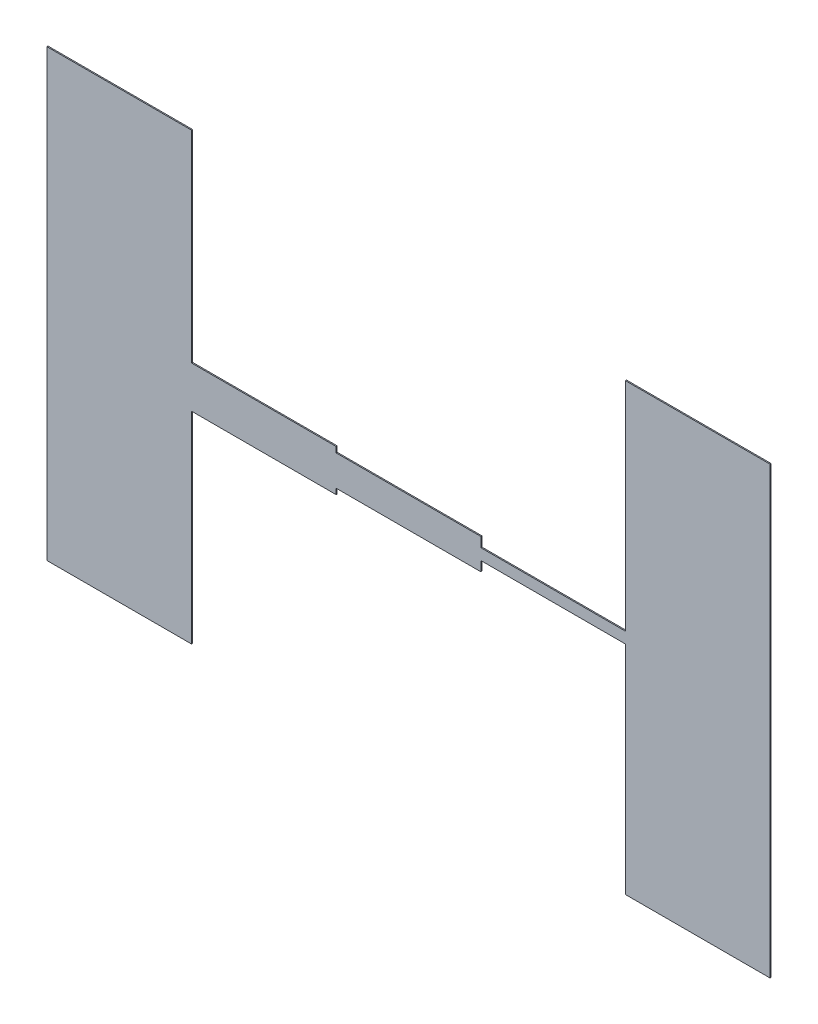
ISO-10303-21;
HEADER;
FILE_DESCRIPTION(('STEP AP214'),'2;1');
FILE_NAME('part.step','',(''),(''),'','','');
FILE_SCHEMA(('AUTOMOTIVE_DESIGN { 1 0 10303 214 1 1 1 1 }'));
ENDSEC;
DATA;
#1=APPLICATION_CONTEXT('core data for automotive mechanical design processes');
#2=APPLICATION_PROTOCOL_DEFINITION('international standard','automotive_design',2000,#1);
#3=PRODUCT_CONTEXT('',#1,'mechanical');
#4=PRODUCT('Part','Part','',(#3));
#5=PRODUCT_RELATED_PRODUCT_CATEGORY('part','',(#4));
#6=PRODUCT_DEFINITION_FORMATION('','',#4);
#7=PRODUCT_DEFINITION_CONTEXT('part definition',#1,'design');
#8=PRODUCT_DEFINITION('design','',#6,#7);
#9=PRODUCT_DEFINITION_SHAPE('','',#8);
#10=(LENGTH_UNIT() NAMED_UNIT(*) SI_UNIT(.MILLI.,.METRE.));
#11=(NAMED_UNIT(*) PLANE_ANGLE_UNIT() SI_UNIT($,.RADIAN.));
#12=(NAMED_UNIT(*) SI_UNIT($,.STERADIAN.) SOLID_ANGLE_UNIT());
#13=UNCERTAINTY_MEASURE_WITH_UNIT(LENGTH_MEASURE(1.E-05),#10,'distance_accuracy_value','');
#14=(GEOMETRIC_REPRESENTATION_CONTEXT(3) GLOBAL_UNCERTAINTY_ASSIGNED_CONTEXT((#13)) GLOBAL_UNIT_ASSIGNED_CONTEXT((#10,
#11,#12)) REPRESENTATION_CONTEXT('',''));
#15=CARTESIAN_POINT('',(0.,0.,0.));
#16=DIRECTION('',(0.,0.,1.));
#17=DIRECTION('',(1.,0.,0.));
#18=AXIS2_PLACEMENT_3D('',#15,#16,#17);
#19=CARTESIAN_POINT('',(4550.,0.,10.));
#20=DIRECTION('',(-1.,0.,0.));
#21=DIRECTION('',(0.,0.,1.));
#22=AXIS2_PLACEMENT_3D('',#19,#20,#21);
#23=PLANE('',#22);
#24=DIRECTION('',(0.,1.,0.));
#25=VECTOR('',#24,1.);
#26=CARTESIAN_POINT('',(4550.,0.,0.));
#27=LINE('',#26,#25);
#28=CARTESIAN_POINT('',(4550.,-2000.,0.));
#29=VERTEX_POINT('',#28);
#30=CARTESIAN_POINT('',(4550.,-49.9999999999999,0.));
#31=VERTEX_POINT('',#30);
#32=EDGE_CURVE('E220',#29,#31,#27,.T.);
#33=ORIENTED_EDGE('',*,*,#32,.F.);
#34=DIRECTION('',(0.,0.,-1.));
#35=VECTOR('',#34,1.);
#36=CARTESIAN_POINT('',(4550.,-2000.,10.));
#37=LINE('',#36,#35);
#38=CARTESIAN_POINT('',(4550.,-2000.,10.));
#39=VERTEX_POINT('',#38);
#40=EDGE_CURVE('E11',#39,#29,#37,.T.);
#41=ORIENTED_EDGE('',*,*,#40,.F.);
#42=DIRECTION('',(0.,1.,0.));
#43=VECTOR('',#42,1.);
#44=CARTESIAN_POINT('',(4550.,0.,10.));
#45=LINE('',#44,#43);
#46=CARTESIAN_POINT('',(4550.,-49.9999999999999,10.));
#47=VERTEX_POINT('',#46);
#48=EDGE_CURVE('E289',#39,#47,#45,.T.);
#49=ORIENTED_EDGE('',*,*,#48,.T.);
#50=DIRECTION('',(0.,0.,-1.));
#51=VECTOR('',#50,1.);
#52=CARTESIAN_POINT('',(4550.,-49.9999999999999,10.));
#53=LINE('',#52,#51);
#54=EDGE_CURVE('E64',#47,#31,#53,.T.);
#55=ORIENTED_EDGE('',*,*,#54,.T.);
#56=EDGE_LOOP('',(#33,#41,#49,#55));
#57=FACE_BOUND('',#56,.T.);
#58=ADVANCED_FACE('F47',(#57),#23,.T.);
#59=CARTESIAN_POINT('',(3.41607084500048E-13,-2000.,10.));
#60=DIRECTION('',(0.,-1.,0.));
#61=DIRECTION('',(1.,0.,0.));
#62=AXIS2_PLACEMENT_3D('',#59,#60,#61);
#63=PLANE('',#62);
#64=DIRECTION('',(-1.,0.,0.));
#65=VECTOR('',#64,1.);
#66=CARTESIAN_POINT('',(3.41607084500048E-13,-2000.,0.));
#67=LINE('',#66,#65);
#68=CARTESIAN_POINT('',(5850.,-2000.,0.));
#69=VERTEX_POINT('',#68);
#70=EDGE_CURVE('E223',#69,#29,#67,.T.);
#71=ORIENTED_EDGE('',*,*,#70,.F.);
#72=DIRECTION('',(0.,0.,-1.));
#73=VECTOR('',#72,1.);
#74=CARTESIAN_POINT('',(5850.,-2000.,10.));
#75=LINE('',#74,#73);
#76=CARTESIAN_POINT('',(5850.,-2000.,10.));
#77=VERTEX_POINT('',#76);
#78=EDGE_CURVE('E56',#77,#69,#75,.T.);
#79=ORIENTED_EDGE('',*,*,#78,.F.);
#80=DIRECTION('',(-1.,0.,0.));
#81=VECTOR('',#80,1.);
#82=CARTESIAN_POINT('',(3.41607084500048E-13,-2000.,10.));
#83=LINE('',#82,#81);
#84=EDGE_CURVE('E359',#77,#39,#83,.T.);
#85=ORIENTED_EDGE('',*,*,#84,.T.);
#86=ORIENTED_EDGE('',*,*,#40,.T.);
#87=EDGE_LOOP('',(#71,#79,#85,#86));
#88=FACE_BOUND('',#87,.T.);
#89=ADVANCED_FACE('F358',(#88),#63,.T.);
#90=CARTESIAN_POINT('',(5850.,0.,10.));
#91=DIRECTION('',(-1.,0.,0.));
#92=DIRECTION('',(0.,0.,1.));
#93=AXIS2_PLACEMENT_3D('',#90,#91,#92);
#94=PLANE('',#93);
#95=DIRECTION('',(0.,1.,0.));
#96=VECTOR('',#95,1.);
#97=CARTESIAN_POINT('',(5850.,0.,0.));
#98=LINE('',#97,#96);
#99=CARTESIAN_POINT('',(5850.,2000.,0.));
#100=VERTEX_POINT('',#99);
#101=EDGE_CURVE('E227',#69,#100,#98,.T.);
#102=ORIENTED_EDGE('',*,*,#101,.T.);
#103=DIRECTION('',(0.,0.,-1.));
#104=VECTOR('',#103,1.);
#105=CARTESIAN_POINT('',(5850.,2000.,10.));
#106=LINE('',#105,#104);
#107=CARTESIAN_POINT('',(5850.,2000.,10.));
#108=VERTEX_POINT('',#107);
#109=EDGE_CURVE('E341',#108,#100,#106,.T.);
#110=ORIENTED_EDGE('',*,*,#109,.F.);
#111=DIRECTION('',(0.,1.,0.));
#112=VECTOR('',#111,1.);
#113=CARTESIAN_POINT('',(5850.,0.,10.));
#114=LINE('',#113,#112);
#115=EDGE_CURVE('E350',#77,#108,#114,.T.);
#116=ORIENTED_EDGE('',*,*,#115,.F.);
#117=ORIENTED_EDGE('',*,*,#78,.T.);
#118=EDGE_LOOP('',(#102,#110,#116,#117));
#119=FACE_BOUND('',#118,.T.);
#120=ADVANCED_FACE('F348',(#119),#94,.F.);
#121=CARTESIAN_POINT('',(0.,2000.,10.));
#122=DIRECTION('',(0.,-1.,0.));
#123=DIRECTION('',(0.,0.,-1.));
#124=AXIS2_PLACEMENT_3D('',#121,#122,#123);
#125=PLANE('',#124);
#126=DIRECTION('',(-1.,0.,0.));
#127=VECTOR('',#126,1.);
#128=CARTESIAN_POINT('',(0.,2000.,0.));
#129=LINE('',#128,#127);
#130=CARTESIAN_POINT('',(4550.,2000.,0.));
#131=VERTEX_POINT('',#130);
#132=EDGE_CURVE('E230',#100,#131,#129,.T.);
#133=ORIENTED_EDGE('',*,*,#132,.T.);
#134=DIRECTION('',(0.,0.,-1.));
#135=VECTOR('',#134,1.);
#136=CARTESIAN_POINT('',(4550.,2000.,10.));
#137=LINE('',#136,#135);
#138=CARTESIAN_POINT('',(4550.,2000.,10.));
#139=VERTEX_POINT('',#138);
#140=EDGE_CURVE('E338',#139,#131,#137,.T.);
#141=ORIENTED_EDGE('',*,*,#140,.F.);
#142=DIRECTION('',(-1.,0.,0.));
#143=VECTOR('',#142,1.);
#144=CARTESIAN_POINT('',(0.,2000.,10.));
#145=LINE('',#144,#143);
#146=EDGE_CURVE('E609',#108,#139,#145,.T.);
#147=ORIENTED_EDGE('',*,*,#146,.F.);
#148=ORIENTED_EDGE('',*,*,#109,.T.);
#149=EDGE_LOOP('',(#133,#141,#147,#148));
#150=FACE_BOUND('',#149,.T.);
#151=ADVANCED_FACE('F377',(#150),#125,.F.);
#152=CARTESIAN_POINT('',(4550.,0.,10.));
#153=DIRECTION('',(-1.,0.,0.));
#154=DIRECTION('',(0.,0.,1.));
#155=AXIS2_PLACEMENT_3D('',#152,#153,#154);
#156=PLANE('',#155);
#157=DIRECTION('',(0.,1.,0.));
#158=VECTOR('',#157,1.);
#159=CARTESIAN_POINT('',(4550.,0.,0.));
#160=LINE('',#159,#158);
#161=CARTESIAN_POINT('',(4550.,50.0000000000001,0.));
#162=VERTEX_POINT('',#161);
#163=EDGE_CURVE('E234',#162,#131,#160,.T.);
#164=ORIENTED_EDGE('',*,*,#163,.F.);
#165=DIRECTION('',(0.,0.,-1.));
#166=VECTOR('',#165,1.);
#167=CARTESIAN_POINT('',(4550.,50.0000000000001,10.));
#168=LINE('',#167,#166);
#169=CARTESIAN_POINT('',(4550.,50.0000000000001,10.));
#170=VERTEX_POINT('',#169);
#171=EDGE_CURVE('E335',#170,#162,#168,.T.);
#172=ORIENTED_EDGE('',*,*,#171,.F.);
#173=DIRECTION('',(0.,1.,0.));
#174=VECTOR('',#173,1.);
#175=CARTESIAN_POINT('',(4550.,0.,10.));
#176=LINE('',#175,#174);
#177=EDGE_CURVE('E607',#170,#139,#176,.T.);
#178=ORIENTED_EDGE('',*,*,#177,.T.);
#179=ORIENTED_EDGE('',*,*,#140,.T.);
#180=EDGE_LOOP('',(#164,#172,#178,#179));
#181=FACE_BOUND('',#180,.T.);
#182=ADVANCED_FACE('F382',(#181),#156,.T.);
#183=CARTESIAN_POINT('',(0.,49.9999999999995,10.));
#184=DIRECTION('',(0.,-1.,0.));
#185=DIRECTION('',(1.,0.,0.));
#186=AXIS2_PLACEMENT_3D('',#183,#184,#185);
#187=PLANE('',#186);
#188=DIRECTION('',(-1.,0.,0.));
#189=VECTOR('',#188,1.);
#190=CARTESIAN_POINT('',(0.,49.9999999999995,0.));
#191=LINE('',#190,#189);
#192=CARTESIAN_POINT('',(3250.,49.9999999999999,0.));
#193=VERTEX_POINT('',#192);
#194=EDGE_CURVE('E238',#162,#193,#191,.T.);
#195=ORIENTED_EDGE('',*,*,#194,.T.);
#196=DIRECTION('',(0.,0.,-1.));
#197=VECTOR('',#196,1.);
#198=CARTESIAN_POINT('',(3250.,49.9999999999999,10.));
#199=LINE('',#198,#197);
#200=CARTESIAN_POINT('',(3250.,49.9999999999999,10.));
#201=VERTEX_POINT('',#200);
#202=EDGE_CURVE('E331',#201,#193,#199,.T.);
#203=ORIENTED_EDGE('',*,*,#202,.F.);
#204=DIRECTION('',(-1.,0.,0.));
#205=VECTOR('',#204,1.);
#206=CARTESIAN_POINT('',(0.,49.9999999999995,10.));
#207=LINE('',#206,#205);
#208=EDGE_CURVE('E602',#170,#201,#207,.T.);
#209=ORIENTED_EDGE('',*,*,#208,.F.);
#210=ORIENTED_EDGE('',*,*,#171,.T.);
#211=EDGE_LOOP('',(#195,#203,#209,#210));
#212=FACE_BOUND('',#211,.T.);
#213=ADVANCED_FACE('F386',(#212),#187,.F.);
#214=CARTESIAN_POINT('',(3250.,0.,10.));
#215=DIRECTION('',(-1.,0.,0.));
#216=DIRECTION('',(0.,0.,1.));
#217=AXIS2_PLACEMENT_3D('',#214,#215,#216);
#218=PLANE('',#217);
#219=DIRECTION('',(0.,1.,0.));
#220=VECTOR('',#219,1.);
#221=CARTESIAN_POINT('',(3250.,0.,0.));
#222=LINE('',#221,#220);
#223=CARTESIAN_POINT('',(3250.,137.5,0.));
#224=VERTEX_POINT('',#223);
#225=EDGE_CURVE('E241',#193,#224,#222,.T.);
#226=ORIENTED_EDGE('',*,*,#225,.T.);
#227=DIRECTION('',(0.,0.,-1.));
#228=VECTOR('',#227,1.);
#229=CARTESIAN_POINT('',(3250.,137.5,10.));
#230=LINE('',#229,#228);
#231=CARTESIAN_POINT('',(3250.,137.5,10.));
#232=VERTEX_POINT('',#231);
#233=EDGE_CURVE('E327',#232,#224,#230,.T.);
#234=ORIENTED_EDGE('',*,*,#233,.F.);
#235=DIRECTION('',(0.,1.,0.));
#236=VECTOR('',#235,1.);
#237=CARTESIAN_POINT('',(3250.,0.,10.));
#238=LINE('',#237,#236);
#239=EDGE_CURVE('E599',#201,#232,#238,.T.);
#240=ORIENTED_EDGE('',*,*,#239,.F.);
#241=ORIENTED_EDGE('',*,*,#202,.T.);
#242=EDGE_LOOP('',(#226,#234,#240,#241));
#243=FACE_BOUND('',#242,.T.);
#244=ADVANCED_FACE('F390',(#243),#218,.F.);
#245=CARTESIAN_POINT('',(0.,137.5,10.));
#246=DIRECTION('',(0.,-1.,0.));
#247=DIRECTION('',(1.,0.,0.));
#248=AXIS2_PLACEMENT_3D('',#245,#246,#247);
#249=PLANE('',#248);
#250=DIRECTION('',(-1.,0.,0.));
#251=VECTOR('',#250,1.);
#252=CARTESIAN_POINT('',(0.,137.5,0.));
#253=LINE('',#252,#251);
#254=CARTESIAN_POINT('',(1950.,137.5,0.));
#255=VERTEX_POINT('',#254);
#256=EDGE_CURVE('E244',#224,#255,#253,.T.);
#257=ORIENTED_EDGE('',*,*,#256,.T.);
#258=DIRECTION('',(0.,0.,-1.));
#259=VECTOR('',#258,1.);
#260=CARTESIAN_POINT('',(1950.,137.5,10.));
#261=LINE('',#260,#259);
#262=CARTESIAN_POINT('',(1950.,137.5,10.));
#263=VERTEX_POINT('',#262);
#264=EDGE_CURVE('E323',#263,#255,#261,.T.);
#265=ORIENTED_EDGE('',*,*,#264,.F.);
#266=DIRECTION('',(-1.,0.,0.));
#267=VECTOR('',#266,1.);
#268=CARTESIAN_POINT('',(0.,137.5,10.));
#269=LINE('',#268,#267);
#270=EDGE_CURVE('E597',#232,#263,#269,.T.);
#271=ORIENTED_EDGE('',*,*,#270,.F.);
#272=ORIENTED_EDGE('',*,*,#233,.T.);
#273=EDGE_LOOP('',(#257,#265,#271,#272));
#274=FACE_BOUND('',#273,.T.);
#275=ADVANCED_FACE('F394',(#274),#249,.F.);
#276=CARTESIAN_POINT('',(1950.,0.,10.));
#277=DIRECTION('',(-1.,0.,0.));
#278=DIRECTION('',(0.,0.,1.));
#279=AXIS2_PLACEMENT_3D('',#276,#277,#278);
#280=PLANE('',#279);
#281=DIRECTION('',(0.,1.,0.));
#282=VECTOR('',#281,1.);
#283=CARTESIAN_POINT('',(1950.,0.,0.));
#284=LINE('',#283,#282);
#285=CARTESIAN_POINT('',(1950.,187.5,0.));
#286=VERTEX_POINT('',#285);
#287=EDGE_CURVE('E247',#255,#286,#284,.T.);
#288=ORIENTED_EDGE('',*,*,#287,.T.);
#289=DIRECTION('',(0.,0.,-1.));
#290=VECTOR('',#289,1.);
#291=CARTESIAN_POINT('',(1950.,187.5,10.));
#292=LINE('',#291,#290);
#293=CARTESIAN_POINT('',(1950.,187.5,10.));
#294=VERTEX_POINT('',#293);
#295=EDGE_CURVE('E319',#294,#286,#292,.T.);
#296=ORIENTED_EDGE('',*,*,#295,.F.);
#297=DIRECTION('',(0.,1.,0.));
#298=VECTOR('',#297,1.);
#299=CARTESIAN_POINT('',(1950.,0.,10.));
#300=LINE('',#299,#298);
#301=EDGE_CURVE('E590',#263,#294,#300,.T.);
#302=ORIENTED_EDGE('',*,*,#301,.F.);
#303=ORIENTED_EDGE('',*,*,#264,.T.);
#304=EDGE_LOOP('',(#288,#296,#302,#303));
#305=FACE_BOUND('',#304,.T.);
#306=ADVANCED_FACE('F398',(#305),#280,.F.);
#307=CARTESIAN_POINT('',(0.,187.499999999999,10.));
#308=DIRECTION('',(0.,-1.,0.));
#309=DIRECTION('',(1.,0.,0.));
#310=AXIS2_PLACEMENT_3D('',#307,#308,#309);
#311=PLANE('',#310);
#312=DIRECTION('',(-1.,0.,0.));
#313=VECTOR('',#312,1.);
#314=CARTESIAN_POINT('',(0.,187.499999999999,0.));
#315=LINE('',#314,#313);
#316=CARTESIAN_POINT('',(650.,187.5,0.));
#317=VERTEX_POINT('',#316);
#318=EDGE_CURVE('E250',#286,#317,#315,.T.);
#319=ORIENTED_EDGE('',*,*,#318,.T.);
#320=DIRECTION('',(0.,0.,-1.));
#321=VECTOR('',#320,1.);
#322=CARTESIAN_POINT('',(650.,187.5,10.));
#323=LINE('',#322,#321);
#324=CARTESIAN_POINT('',(650.,187.5,10.));
#325=VERTEX_POINT('',#324);
#326=EDGE_CURVE('E315',#325,#317,#323,.T.);
#327=ORIENTED_EDGE('',*,*,#326,.F.);
#328=DIRECTION('',(-1.,0.,0.));
#329=VECTOR('',#328,1.);
#330=CARTESIAN_POINT('',(0.,187.499999999999,10.));
#331=LINE('',#330,#329);
#332=EDGE_CURVE('E587',#294,#325,#331,.T.);
#333=ORIENTED_EDGE('',*,*,#332,.F.);
#334=ORIENTED_EDGE('',*,*,#295,.T.);
#335=EDGE_LOOP('',(#319,#327,#333,#334));
#336=FACE_BOUND('',#335,.T.);
#337=ADVANCED_FACE('F402',(#336),#311,.F.);
#338=CARTESIAN_POINT('',(650.,0.,10.));
#339=DIRECTION('',(-1.,0.,0.));
#340=DIRECTION('',(0.,0.,1.));
#341=AXIS2_PLACEMENT_3D('',#338,#339,#340);
#342=PLANE('',#341);
#343=DIRECTION('',(0.,1.,0.));
#344=VECTOR('',#343,1.);
#345=CARTESIAN_POINT('',(650.,0.,0.));
#346=LINE('',#345,#344);
#347=CARTESIAN_POINT('',(650.,2000.,0.));
#348=VERTEX_POINT('',#347);
#349=EDGE_CURVE('E253',#317,#348,#346,.T.);
#350=ORIENTED_EDGE('',*,*,#349,.T.);
#351=DIRECTION('',(0.,0.,-1.));
#352=VECTOR('',#351,1.);
#353=CARTESIAN_POINT('',(650.,2000.,10.));
#354=LINE('',#353,#352);
#355=CARTESIAN_POINT('',(650.,2000.,10.));
#356=VERTEX_POINT('',#355);
#357=EDGE_CURVE('E312',#356,#348,#354,.T.);
#358=ORIENTED_EDGE('',*,*,#357,.F.);
#359=DIRECTION('',(0.,1.,0.));
#360=VECTOR('',#359,1.);
#361=CARTESIAN_POINT('',(650.,0.,10.));
#362=LINE('',#361,#360);
#363=EDGE_CURVE('E585',#325,#356,#362,.T.);
#364=ORIENTED_EDGE('',*,*,#363,.F.);
#365=ORIENTED_EDGE('',*,*,#326,.T.);
#366=EDGE_LOOP('',(#350,#358,#364,#365));
#367=FACE_BOUND('',#366,.T.);
#368=ADVANCED_FACE('F406',(#367),#342,.F.);
#369=CARTESIAN_POINT('',(0.,2000.,10.));
#370=DIRECTION('',(0.,1.,0.));
#371=DIRECTION('',(0.,0.,1.));
#372=AXIS2_PLACEMENT_3D('',#369,#370,#371);
#373=PLANE('',#372);
#374=DIRECTION('',(1.,0.,0.));
#375=VECTOR('',#374,1.);
#376=CARTESIAN_POINT('',(0.,2000.,0.));
#377=LINE('',#376,#375);
#378=CARTESIAN_POINT('',(-650.,2000.,0.));
#379=VERTEX_POINT('',#378);
#380=EDGE_CURVE('E257',#379,#348,#377,.T.);
#381=ORIENTED_EDGE('',*,*,#380,.F.);
#382=DIRECTION('',(0.,0.,-1.));
#383=VECTOR('',#382,1.);
#384=CARTESIAN_POINT('',(-650.,2000.,10.));
#385=LINE('',#384,#383);
#386=CARTESIAN_POINT('',(-650.,2000.,10.));
#387=VERTEX_POINT('',#386);
#388=EDGE_CURVE('E309',#387,#379,#385,.T.);
#389=ORIENTED_EDGE('',*,*,#388,.F.);
#390=DIRECTION('',(1.,0.,0.));
#391=VECTOR('',#390,1.);
#392=CARTESIAN_POINT('',(0.,2000.,10.));
#393=LINE('',#392,#391);
#394=EDGE_CURVE('E630',#387,#356,#393,.T.);
#395=ORIENTED_EDGE('',*,*,#394,.T.);
#396=ORIENTED_EDGE('',*,*,#357,.T.);
#397=EDGE_LOOP('',(#381,#389,#395,#396));
#398=FACE_BOUND('',#397,.T.);
#399=ADVANCED_FACE('F410',(#398),#373,.T.);
#400=CARTESIAN_POINT('',(-650.,0.,10.));
#401=DIRECTION('',(-1.,0.,0.));
#402=DIRECTION('',(0.,0.,1.));
#403=AXIS2_PLACEMENT_3D('',#400,#401,#402);
#404=PLANE('',#403);
#405=DIRECTION('',(0.,1.,0.));
#406=VECTOR('',#405,1.);
#407=CARTESIAN_POINT('',(-650.,0.,0.));
#408=LINE('',#407,#406);
#409=CARTESIAN_POINT('',(-650.,-2000.,0.));
#410=VERTEX_POINT('',#409);
#411=EDGE_CURVE('E261',#410,#379,#408,.T.);
#412=ORIENTED_EDGE('',*,*,#411,.F.);
#413=DIRECTION('',(0.,0.,-1.));
#414=VECTOR('',#413,1.);
#415=CARTESIAN_POINT('',(-650.,-2000.,10.));
#416=LINE('',#415,#414);
#417=CARTESIAN_POINT('',(-650.,-2000.,10.));
#418=VERTEX_POINT('',#417);
#419=EDGE_CURVE('E306',#418,#410,#416,.T.);
#420=ORIENTED_EDGE('',*,*,#419,.F.);
#421=DIRECTION('',(0.,1.,0.));
#422=VECTOR('',#421,1.);
#423=CARTESIAN_POINT('',(-650.,0.,10.));
#424=LINE('',#423,#422);
#425=EDGE_CURVE('E576',#418,#387,#424,.T.);
#426=ORIENTED_EDGE('',*,*,#425,.T.);
#427=ORIENTED_EDGE('',*,*,#388,.T.);
#428=EDGE_LOOP('',(#412,#420,#426,#427));
#429=FACE_BOUND('',#428,.T.);
#430=ADVANCED_FACE('F414',(#429),#404,.T.);
#431=CARTESIAN_POINT('',(0.,-2000.,10.));
#432=DIRECTION('',(0.,1.,0.));
#433=DIRECTION('',(0.,0.,1.));
#434=AXIS2_PLACEMENT_3D('',#431,#432,#433);
#435=PLANE('',#434);
#436=DIRECTION('',(1.,0.,0.));
#437=VECTOR('',#436,1.);
#438=CARTESIAN_POINT('',(0.,-2000.,0.));
#439=LINE('',#438,#437);
#440=CARTESIAN_POINT('',(650.,-2000.,0.));
#441=VERTEX_POINT('',#440);
#442=EDGE_CURVE('E265',#410,#441,#439,.T.);
#443=ORIENTED_EDGE('',*,*,#442,.T.);
#444=DIRECTION('',(0.,0.,-1.));
#445=VECTOR('',#444,1.);
#446=CARTESIAN_POINT('',(650.,-2000.,10.));
#447=LINE('',#446,#445);
#448=CARTESIAN_POINT('',(650.,-2000.,10.));
#449=VERTEX_POINT('',#448);
#450=EDGE_CURVE('E302',#449,#441,#447,.T.);
#451=ORIENTED_EDGE('',*,*,#450,.F.);
#452=DIRECTION('',(1.,0.,0.));
#453=VECTOR('',#452,1.);
#454=CARTESIAN_POINT('',(0.,-2000.,10.));
#455=LINE('',#454,#453);
#456=EDGE_CURVE('E635',#418,#449,#455,.T.);
#457=ORIENTED_EDGE('',*,*,#456,.F.);
#458=ORIENTED_EDGE('',*,*,#419,.T.);
#459=EDGE_LOOP('',(#443,#451,#457,#458));
#460=FACE_BOUND('',#459,.T.);
#461=ADVANCED_FACE('F418',(#460),#435,.F.);
#462=CARTESIAN_POINT('',(650.,0.,10.));
#463=DIRECTION('',(-1.,0.,0.));
#464=DIRECTION('',(0.,-1.,0.));
#465=AXIS2_PLACEMENT_3D('',#462,#463,#464);
#466=PLANE('',#465);
#467=DIRECTION('',(0.,1.,0.));
#468=VECTOR('',#467,1.);
#469=CARTESIAN_POINT('',(650.,0.,0.));
#470=LINE('',#469,#468);
#471=CARTESIAN_POINT('',(650.,-187.5,0.));
#472=VERTEX_POINT('',#471);
#473=EDGE_CURVE('E268',#441,#472,#470,.T.);
#474=ORIENTED_EDGE('',*,*,#473,.T.);
#475=DIRECTION('',(0.,0.,-1.));
#476=VECTOR('',#475,1.);
#477=CARTESIAN_POINT('',(650.,-187.5,10.));
#478=LINE('',#477,#476);
#479=CARTESIAN_POINT('',(650.,-187.5,10.));
#480=VERTEX_POINT('',#479);
#481=EDGE_CURVE('E299',#480,#472,#478,.T.);
#482=ORIENTED_EDGE('',*,*,#481,.F.);
#483=DIRECTION('',(0.,1.,0.));
#484=VECTOR('',#483,1.);
#485=CARTESIAN_POINT('',(650.,0.,10.));
#486=LINE('',#485,#484);
#487=EDGE_CURVE('E638',#449,#480,#486,.T.);
#488=ORIENTED_EDGE('',*,*,#487,.F.);
#489=ORIENTED_EDGE('',*,*,#450,.T.);
#490=EDGE_LOOP('',(#474,#482,#488,#489));
#491=FACE_BOUND('',#490,.T.);
#492=ADVANCED_FACE('F422',(#491),#466,.F.);
#493=CARTESIAN_POINT('',(0.,-187.500000000001,10.));
#494=DIRECTION('',(0.,-1.,0.));
#495=DIRECTION('',(1.,0.,0.));
#496=AXIS2_PLACEMENT_3D('',#493,#494,#495);
#497=PLANE('',#496);
#498=DIRECTION('',(-1.,0.,0.));
#499=VECTOR('',#498,1.);
#500=CARTESIAN_POINT('',(0.,-187.500000000001,0.));
#501=LINE('',#500,#499);
#502=CARTESIAN_POINT('',(1950.,-187.5,0.));
#503=VERTEX_POINT('',#502);
#504=EDGE_CURVE('E272',#503,#472,#501,.T.);
#505=ORIENTED_EDGE('',*,*,#504,.F.);
#506=DIRECTION('',(0.,0.,-1.));
#507=VECTOR('',#506,1.);
#508=CARTESIAN_POINT('',(1950.,-187.5,10.));
#509=LINE('',#508,#507);
#510=CARTESIAN_POINT('',(1950.,-187.5,10.));
#511=VERTEX_POINT('',#510);
#512=EDGE_CURVE('E296',#511,#503,#509,.T.);
#513=ORIENTED_EDGE('',*,*,#512,.F.);
#514=DIRECTION('',(-1.,0.,0.));
#515=VECTOR('',#514,1.);
#516=CARTESIAN_POINT('',(0.,-187.500000000001,10.));
#517=LINE('',#516,#515);
#518=EDGE_CURVE('E214',#511,#480,#517,.T.);
#519=ORIENTED_EDGE('',*,*,#518,.T.);
#520=ORIENTED_EDGE('',*,*,#481,.T.);
#521=EDGE_LOOP('',(#505,#513,#519,#520));
#522=FACE_BOUND('',#521,.T.);
#523=ADVANCED_FACE('F426',(#522),#497,.T.);
#524=CARTESIAN_POINT('',(1950.,0.,10.));
#525=DIRECTION('',(-1.,0.,0.));
#526=DIRECTION('',(0.,0.,1.));
#527=AXIS2_PLACEMENT_3D('',#524,#525,#526);
#528=PLANE('',#527);
#529=DIRECTION('',(0.,1.,0.));
#530=VECTOR('',#529,1.);
#531=CARTESIAN_POINT('',(1950.,0.,0.));
#532=LINE('',#531,#530);
#533=CARTESIAN_POINT('',(1950.,-137.5,0.));
#534=VERTEX_POINT('',#533);
#535=EDGE_CURVE('E276',#503,#534,#532,.T.);
#536=ORIENTED_EDGE('',*,*,#535,.T.);
#537=DIRECTION('',(0.,0.,-1.));
#538=VECTOR('',#537,1.);
#539=CARTESIAN_POINT('',(1950.,-137.5,10.));
#540=LINE('',#539,#538);
#541=CARTESIAN_POINT('',(1950.,-137.5,10.));
#542=VERTEX_POINT('',#541);
#543=EDGE_CURVE('E197',#542,#534,#540,.T.);
#544=ORIENTED_EDGE('',*,*,#543,.F.);
#545=DIRECTION('',(0.,1.,0.));
#546=VECTOR('',#545,1.);
#547=CARTESIAN_POINT('',(1950.,0.,10.));
#548=LINE('',#547,#546);
#549=EDGE_CURVE('E209',#511,#542,#548,.T.);
#550=ORIENTED_EDGE('',*,*,#549,.F.);
#551=ORIENTED_EDGE('',*,*,#512,.T.);
#552=EDGE_LOOP('',(#536,#544,#550,#551));
#553=FACE_BOUND('',#552,.T.);
#554=ADVANCED_FACE('F430',(#553),#528,.F.);
#555=CARTESIAN_POINT('',(0.,-137.5,10.));
#556=DIRECTION('',(0.,-1.,0.));
#557=DIRECTION('',(1.,0.,0.));
#558=AXIS2_PLACEMENT_3D('',#555,#556,#557);
#559=PLANE('',#558);
#560=DIRECTION('',(-1.,0.,0.));
#561=VECTOR('',#560,1.);
#562=CARTESIAN_POINT('',(0.,-137.5,0.));
#563=LINE('',#562,#561);
#564=CARTESIAN_POINT('',(3250.,-137.5,0.));
#565=VERTEX_POINT('',#564);
#566=EDGE_CURVE('E193',#565,#534,#563,.T.);
#567=ORIENTED_EDGE('',*,*,#566,.F.);
#568=DIRECTION('',(0.,0.,-1.));
#569=VECTOR('',#568,1.);
#570=CARTESIAN_POINT('',(3250.,-137.5,10.));
#571=LINE('',#570,#569);
#572=CARTESIAN_POINT('',(3250.,-137.5,10.));
#573=VERTEX_POINT('',#572);
#574=EDGE_CURVE('E187',#573,#565,#571,.T.);
#575=ORIENTED_EDGE('',*,*,#574,.F.);
#576=DIRECTION('',(-1.,0.,0.));
#577=VECTOR('',#576,1.);
#578=CARTESIAN_POINT('',(0.,-137.5,10.));
#579=LINE('',#578,#577);
#580=EDGE_CURVE('E191',#573,#542,#579,.T.);
#581=ORIENTED_EDGE('',*,*,#580,.T.);
#582=ORIENTED_EDGE('',*,*,#543,.T.);
#583=EDGE_LOOP('',(#567,#575,#581,#582));
#584=FACE_BOUND('',#583,.T.);
#585=ADVANCED_FACE('F189',(#584),#559,.T.);
#586=CARTESIAN_POINT('',(3250.,0.,10.));
#587=DIRECTION('',(-1.,0.,0.));
#588=DIRECTION('',(0.,0.,1.));
#589=AXIS2_PLACEMENT_3D('',#586,#587,#588);
#590=PLANE('',#589);
#591=DIRECTION('',(0.,1.,0.));
#592=VECTOR('',#591,1.);
#593=CARTESIAN_POINT('',(3250.,0.,0.));
#594=LINE('',#593,#592);
#595=CARTESIAN_POINT('',(3250.,-50.0000000000001,0.));
#596=VERTEX_POINT('',#595);
#597=EDGE_CURVE('E282',#565,#596,#594,.T.);
#598=ORIENTED_EDGE('',*,*,#597,.T.);
#599=DIRECTION('',(0.,0.,-1.));
#600=VECTOR('',#599,1.);
#601=CARTESIAN_POINT('',(3250.,-50.0000000000001,10.));
#602=LINE('',#601,#600);
#603=CARTESIAN_POINT('',(3250.,-50.0000000000001,10.));
#604=VERTEX_POINT('',#603);
#605=EDGE_CURVE('E126',#604,#596,#602,.T.);
#606=ORIENTED_EDGE('',*,*,#605,.F.);
#607=DIRECTION('',(0.,1.,0.));
#608=VECTOR('',#607,1.);
#609=CARTESIAN_POINT('',(3250.,0.,10.));
#610=LINE('',#609,#608);
#611=EDGE_CURVE('E199',#573,#604,#610,.T.);
#612=ORIENTED_EDGE('',*,*,#611,.F.);
#613=ORIENTED_EDGE('',*,*,#574,.T.);
#614=EDGE_LOOP('',(#598,#606,#612,#613));
#615=FACE_BOUND('',#614,.T.);
#616=ADVANCED_FACE('F200',(#615),#590,.F.);
#617=CARTESIAN_POINT('',(0.,-50.0000000000004,10.));
#618=DIRECTION('',(0.,-1.,0.));
#619=DIRECTION('',(1.,0.,0.));
#620=AXIS2_PLACEMENT_3D('',#617,#618,#619);
#621=PLANE('',#620);
#622=DIRECTION('',(-1.,0.,0.));
#623=VECTOR('',#622,1.);
#624=CARTESIAN_POINT('',(0.,-50.0000000000004,0.));
#625=LINE('',#624,#623);
#626=EDGE_CURVE('E285',#31,#596,#625,.T.);
#627=ORIENTED_EDGE('',*,*,#626,.F.);
#628=ORIENTED_EDGE('',*,*,#54,.F.);
#629=DIRECTION('',(-1.,0.,0.));
#630=VECTOR('',#629,1.);
#631=CARTESIAN_POINT('',(0.,-50.0000000000004,10.));
#632=LINE('',#631,#630);
#633=EDGE_CURVE('E204',#47,#604,#632,.T.);
#634=ORIENTED_EDGE('',*,*,#633,.T.);
#635=ORIENTED_EDGE('',*,*,#605,.T.);
#636=EDGE_LOOP('',(#627,#628,#634,#635));
#637=FACE_BOUND('',#636,.T.);
#638=ADVANCED_FACE('F360',(#637),#621,.T.);
#639=CARTESIAN_POINT('',(0.,0.,10.));
#640=DIRECTION('',(0.,0.,1.));
#641=DIRECTION('',(1.,0.,0.));
#642=AXIS2_PLACEMENT_3D('',#639,#640,#641);
#643=PLANE('',#642);
#644=ORIENTED_EDGE('',*,*,#48,.F.);
#645=ORIENTED_EDGE('',*,*,#84,.F.);
#646=ORIENTED_EDGE('',*,*,#115,.T.);
#647=ORIENTED_EDGE('',*,*,#146,.T.);
#648=ORIENTED_EDGE('',*,*,#177,.F.);
#649=ORIENTED_EDGE('',*,*,#208,.T.);
#650=ORIENTED_EDGE('',*,*,#239,.T.);
#651=ORIENTED_EDGE('',*,*,#270,.T.);
#652=ORIENTED_EDGE('',*,*,#301,.T.);
#653=ORIENTED_EDGE('',*,*,#332,.T.);
#654=ORIENTED_EDGE('',*,*,#363,.T.);
#655=ORIENTED_EDGE('',*,*,#394,.F.);
#656=ORIENTED_EDGE('',*,*,#425,.F.);
#657=ORIENTED_EDGE('',*,*,#456,.T.);
#658=ORIENTED_EDGE('',*,*,#487,.T.);
#659=ORIENTED_EDGE('',*,*,#518,.F.);
#660=ORIENTED_EDGE('',*,*,#549,.T.);
#661=ORIENTED_EDGE('',*,*,#580,.F.);
#662=ORIENTED_EDGE('',*,*,#611,.T.);
#663=ORIENTED_EDGE('',*,*,#633,.F.);
#664=EDGE_LOOP('',(#644,#645,#646,#647,#648,#649,#650,#651,#652,#653,#654,#655,#656,#657,#658,
#659,#660,#661,#662,#663));
#665=FACE_BOUND('',#664,.T.);
#666=ADVANCED_FACE('F206',(#665),#643,.T.);
#667=CARTESIAN_POINT('',(0.,0.,0.));
#668=DIRECTION('',(0.,0.,1.));
#669=DIRECTION('',(1.,0.,0.));
#670=AXIS2_PLACEMENT_3D('',#667,#668,#669);
#671=PLANE('',#670);
#672=ORIENTED_EDGE('',*,*,#32,.T.);
#673=ORIENTED_EDGE('',*,*,#626,.T.);
#674=ORIENTED_EDGE('',*,*,#597,.F.);
#675=ORIENTED_EDGE('',*,*,#566,.T.);
#676=ORIENTED_EDGE('',*,*,#535,.F.);
#677=ORIENTED_EDGE('',*,*,#504,.T.);
#678=ORIENTED_EDGE('',*,*,#473,.F.);
#679=ORIENTED_EDGE('',*,*,#442,.F.);
#680=ORIENTED_EDGE('',*,*,#411,.T.);
#681=ORIENTED_EDGE('',*,*,#380,.T.);
#682=ORIENTED_EDGE('',*,*,#349,.F.);
#683=ORIENTED_EDGE('',*,*,#318,.F.);
#684=ORIENTED_EDGE('',*,*,#287,.F.);
#685=ORIENTED_EDGE('',*,*,#256,.F.);
#686=ORIENTED_EDGE('',*,*,#225,.F.);
#687=ORIENTED_EDGE('',*,*,#194,.F.);
#688=ORIENTED_EDGE('',*,*,#163,.T.);
#689=ORIENTED_EDGE('',*,*,#132,.F.);
#690=ORIENTED_EDGE('',*,*,#101,.F.);
#691=ORIENTED_EDGE('',*,*,#70,.T.);
#692=EDGE_LOOP('',(#672,#673,#674,#675,#676,#677,#678,#679,#680,#681,#682,#683,#684,#685,#686,
#687,#688,#689,#690,#691));
#693=FACE_BOUND('',#692,.T.);
#694=ADVANCED_FACE('F357',(#693),#671,.F.);
#695=CLOSED_SHELL('',(#58,#89,#120,#151,#182,#213,#244,#275,#306,#337,#368,#399,#430,#461,#492,
#523,#554,#585,#616,#638,#666,#694));
#696=MANIFOLD_SOLID_BREP('B2',#695);
#697=ADVANCED_BREP_SHAPE_REPRESENTATION('',(#18,#696),#14);
#698=SHAPE_DEFINITION_REPRESENTATION(#9,#697);
ENDSEC;
END-ISO-10303-21;
